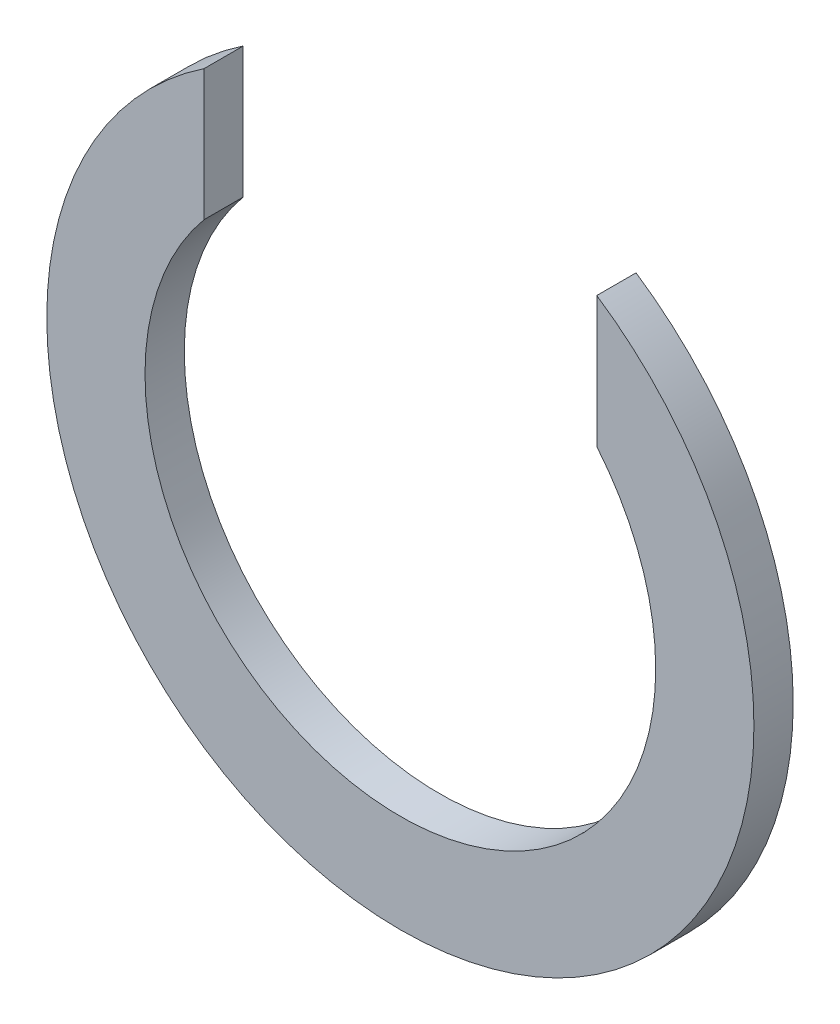
ISO-10303-21;
HEADER;
FILE_DESCRIPTION(('STEP AP214'),'2;1');
FILE_NAME('part.step','',(''),(''),'','','');
FILE_SCHEMA(('AUTOMOTIVE_DESIGN { 1 0 10303 214 1 1 1 1 }'));
ENDSEC;
DATA;
#1=APPLICATION_CONTEXT('core data for automotive mechanical design processes');
#2=APPLICATION_PROTOCOL_DEFINITION('international standard','automotive_design',2000,#1);
#3=PRODUCT_CONTEXT('',#1,'mechanical');
#4=PRODUCT('Part','Part','',(#3));
#5=PRODUCT_RELATED_PRODUCT_CATEGORY('part','',(#4));
#6=PRODUCT_DEFINITION_FORMATION('','',#4);
#7=PRODUCT_DEFINITION_CONTEXT('part definition',#1,'design');
#8=PRODUCT_DEFINITION('design','',#6,#7);
#9=PRODUCT_DEFINITION_SHAPE('','',#8);
#10=(LENGTH_UNIT() NAMED_UNIT(*) SI_UNIT(.MILLI.,.METRE.));
#11=(NAMED_UNIT(*) PLANE_ANGLE_UNIT() SI_UNIT($,.RADIAN.));
#12=(NAMED_UNIT(*) SI_UNIT($,.STERADIAN.) SOLID_ANGLE_UNIT());
#13=UNCERTAINTY_MEASURE_WITH_UNIT(LENGTH_MEASURE(1.E-05),#10,'distance_accuracy_value','');
#14=(GEOMETRIC_REPRESENTATION_CONTEXT(3) GLOBAL_UNCERTAINTY_ASSIGNED_CONTEXT((#13)) GLOBAL_UNIT_ASSIGNED_CONTEXT((#10,
#11,#12)) REPRESENTATION_CONTEXT('',''));
#15=CARTESIAN_POINT('',(0.,0.,0.));
#16=DIRECTION('',(0.,0.,1.));
#17=DIRECTION('',(1.,0.,0.));
#18=AXIS2_PLACEMENT_3D('',#15,#16,#17);
#19=CARTESIAN_POINT('',(0.,0.,2.));
#20=DIRECTION('',(0.,0.,-1.));
#21=DIRECTION('',(-1.,0.,0.));
#22=AXIS2_PLACEMENT_3D('',#19,#20,#21);
#23=CYLINDRICAL_SURFACE('',#22,13.);
#24=CARTESIAN_POINT('',(0.,0.,0.));
#25=DIRECTION('',(0.,0.,-1.));
#26=DIRECTION('',(1.,0.,0.));
#27=AXIS2_PLACEMENT_3D('',#24,#25,#26);
#28=CIRCLE('',#27,13.);
#29=CARTESIAN_POINT('',(10.,8.30662386291807,0.));
#30=VERTEX_POINT('',#29);
#31=CARTESIAN_POINT('',(-10.,8.30662386291807,0.));
#32=VERTEX_POINT('',#31);
#33=EDGE_CURVE('E107',#30,#32,#28,.T.);
#34=ORIENTED_EDGE('',*,*,#33,.T.);
#35=DIRECTION('',(0.,0.,-1.));
#36=VECTOR('',#35,1.);
#37=CARTESIAN_POINT('',(-10.,8.30662386291807,2.));
#38=LINE('',#37,#36);
#39=CARTESIAN_POINT('',(-10.,8.30662386291807,2.));
#40=VERTEX_POINT('',#39);
#41=EDGE_CURVE('E11',#40,#32,#38,.T.);
#42=ORIENTED_EDGE('',*,*,#41,.F.);
#43=CARTESIAN_POINT('',(0.,0.,2.));
#44=DIRECTION('',(0.,0.,-1.));
#45=DIRECTION('',(1.,0.,0.));
#46=AXIS2_PLACEMENT_3D('',#43,#44,#45);
#47=CIRCLE('',#46,13.);
#48=CARTESIAN_POINT('',(10.,8.30662386291807,2.));
#49=VERTEX_POINT('',#48);
#50=EDGE_CURVE('E91',#49,#40,#47,.T.);
#51=ORIENTED_EDGE('',*,*,#50,.F.);
#52=DIRECTION('',(0.,0.,-1.));
#53=VECTOR('',#52,1.);
#54=CARTESIAN_POINT('',(10.,8.30662386291807,2.));
#55=LINE('',#54,#53);
#56=EDGE_CURVE('E103',#49,#30,#55,.T.);
#57=ORIENTED_EDGE('',*,*,#56,.T.);
#58=EDGE_LOOP('',(#34,#42,#51,#57));
#59=FACE_BOUND('',#58,.T.);
#60=ADVANCED_FACE('F39',(#59),#23,.F.);
#61=CARTESIAN_POINT('',(-10.,8.30662386291807,2.));
#62=DIRECTION('',(-1.,0.,0.));
#63=DIRECTION('',(0.,0.,1.));
#64=AXIS2_PLACEMENT_3D('',#61,#62,#63);
#65=PLANE('',#64);
#66=DIRECTION('',(0.,1.,0.));
#67=VECTOR('',#66,1.);
#68=CARTESIAN_POINT('',(-10.,8.30662386291807,0.));
#69=LINE('',#68,#67);
#70=CARTESIAN_POINT('',(-10.,14.9666295470958,0.));
#71=VERTEX_POINT('',#70);
#72=EDGE_CURVE('E96',#32,#71,#69,.T.);
#73=ORIENTED_EDGE('',*,*,#72,.T.);
#74=DIRECTION('',(0.,0.,-1.));
#75=VECTOR('',#74,1.);
#76=CARTESIAN_POINT('',(-10.,14.9666295470958,2.));
#77=LINE('',#76,#75);
#78=CARTESIAN_POINT('',(-10.,14.9666295470958,2.));
#79=VERTEX_POINT('',#78);
#80=EDGE_CURVE('E48',#79,#71,#77,.T.);
#81=ORIENTED_EDGE('',*,*,#80,.F.);
#82=DIRECTION('',(0.,1.,0.));
#83=VECTOR('',#82,1.);
#84=CARTESIAN_POINT('',(-10.,8.30662386291807,2.));
#85=LINE('',#84,#83);
#86=EDGE_CURVE('E86',#40,#79,#85,.T.);
#87=ORIENTED_EDGE('',*,*,#86,.F.);
#88=ORIENTED_EDGE('',*,*,#41,.T.);
#89=EDGE_LOOP('',(#73,#81,#87,#88));
#90=FACE_BOUND('',#89,.T.);
#91=ADVANCED_FACE('F95',(#90),#65,.F.);
#92=CARTESIAN_POINT('',(0.,0.,2.));
#93=DIRECTION('',(0.,0.,-1.));
#94=DIRECTION('',(-1.,0.,0.));
#95=AXIS2_PLACEMENT_3D('',#92,#93,#94);
#96=CYLINDRICAL_SURFACE('',#95,18.);
#97=CARTESIAN_POINT('',(0.,0.,0.));
#98=DIRECTION('',(0.,0.,1.));
#99=DIRECTION('',(1.,0.,0.));
#100=AXIS2_PLACEMENT_3D('',#97,#98,#99);
#101=CIRCLE('',#100,18.);
#102=CARTESIAN_POINT('',(10.,14.9666295470958,0.));
#103=VERTEX_POINT('',#102);
#104=EDGE_CURVE('E73',#71,#103,#101,.T.);
#105=ORIENTED_EDGE('',*,*,#104,.T.);
#106=DIRECTION('',(0.,0.,-1.));
#107=VECTOR('',#106,1.);
#108=CARTESIAN_POINT('',(10.,14.9666295470958,2.));
#109=LINE('',#108,#107);
#110=CARTESIAN_POINT('',(10.,14.9666295470958,2.));
#111=VERTEX_POINT('',#110);
#112=EDGE_CURVE('E98',#111,#103,#109,.T.);
#113=ORIENTED_EDGE('',*,*,#112,.F.);
#114=CARTESIAN_POINT('',(0.,0.,2.));
#115=DIRECTION('',(0.,0.,1.));
#116=DIRECTION('',(1.,0.,0.));
#117=AXIS2_PLACEMENT_3D('',#114,#115,#116);
#118=CIRCLE('',#117,18.);
#119=EDGE_CURVE('E89',#79,#111,#118,.T.);
#120=ORIENTED_EDGE('',*,*,#119,.F.);
#121=ORIENTED_EDGE('',*,*,#80,.T.);
#122=EDGE_LOOP('',(#105,#113,#120,#121));
#123=FACE_BOUND('',#122,.T.);
#124=ADVANCED_FACE('F99',(#123),#96,.T.);
#125=CARTESIAN_POINT('',(10.,8.30662386291807,2.));
#126=DIRECTION('',(1.,0.,0.));
#127=DIRECTION('',(0.,0.,-1.));
#128=AXIS2_PLACEMENT_3D('',#125,#126,#127);
#129=PLANE('',#128);
#130=DIRECTION('',(0.,-1.,0.));
#131=VECTOR('',#130,1.);
#132=CARTESIAN_POINT('',(10.,8.30662386291807,0.));
#133=LINE('',#132,#131);
#134=EDGE_CURVE('E79',#103,#30,#133,.T.);
#135=ORIENTED_EDGE('',*,*,#134,.T.);
#136=ORIENTED_EDGE('',*,*,#56,.F.);
#137=DIRECTION('',(0.,-1.,0.));
#138=VECTOR('',#137,1.);
#139=CARTESIAN_POINT('',(10.,8.30662386291807,2.));
#140=LINE('',#139,#138);
#141=EDGE_CURVE('E56',#111,#49,#140,.T.);
#142=ORIENTED_EDGE('',*,*,#141,.F.);
#143=ORIENTED_EDGE('',*,*,#112,.T.);
#144=EDGE_LOOP('',(#135,#136,#142,#143));
#145=FACE_BOUND('',#144,.T.);
#146=ADVANCED_FACE('F120',(#145),#129,.F.);
#147=CARTESIAN_POINT('',(0.,0.,2.));
#148=DIRECTION('',(0.,0.,1.));
#149=DIRECTION('',(1.,0.,0.));
#150=AXIS2_PLACEMENT_3D('',#147,#148,#149);
#151=PLANE('',#150);
#152=ORIENTED_EDGE('',*,*,#50,.T.);
#153=ORIENTED_EDGE('',*,*,#86,.T.);
#154=ORIENTED_EDGE('',*,*,#119,.T.);
#155=ORIENTED_EDGE('',*,*,#141,.T.);
#156=EDGE_LOOP('',(#152,#153,#154,#155));
#157=FACE_BOUND('',#156,.T.);
#158=ADVANCED_FACE('F87',(#157),#151,.T.);
#159=CARTESIAN_POINT('',(0.,0.,0.));
#160=DIRECTION('',(0.,0.,1.));
#161=DIRECTION('',(1.,0.,0.));
#162=AXIS2_PLACEMENT_3D('',#159,#160,#161);
#163=PLANE('',#162);
#164=ORIENTED_EDGE('',*,*,#33,.F.);
#165=ORIENTED_EDGE('',*,*,#134,.F.);
#166=ORIENTED_EDGE('',*,*,#104,.F.);
#167=ORIENTED_EDGE('',*,*,#72,.F.);
#168=EDGE_LOOP('',(#164,#165,#166,#167));
#169=FACE_BOUND('',#168,.T.);
#170=ADVANCED_FACE('F123',(#169),#163,.F.);
#171=CLOSED_SHELL('',(#60,#91,#124,#146,#158,#170));
#172=MANIFOLD_SOLID_BREP('B2',#171);
#173=ADVANCED_BREP_SHAPE_REPRESENTATION('',(#18,#172),#14);
#174=SHAPE_DEFINITION_REPRESENTATION(#9,#173);
ENDSEC;
END-ISO-10303-21;
